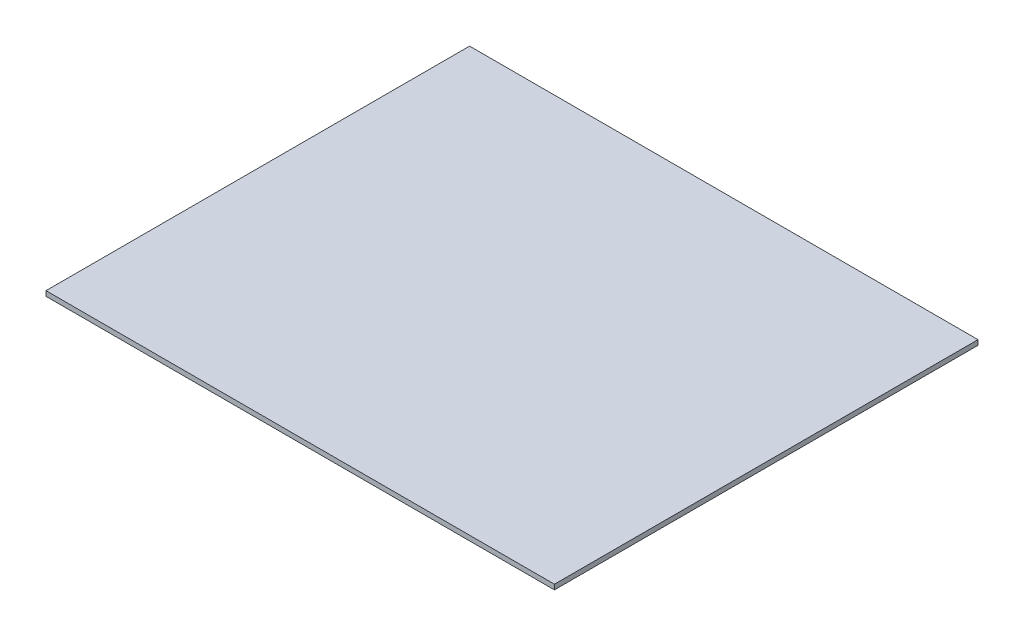
ISO-10303-21;
HEADER;
FILE_DESCRIPTION(('STEP AP214'),'2;1');
FILE_NAME('part.step','',(''),(''),'','','');
FILE_SCHEMA(('AUTOMOTIVE_DESIGN { 1 0 10303 214 1 1 1 1 }'));
ENDSEC;
DATA;
#1=APPLICATION_CONTEXT('core data for automotive mechanical design processes');
#2=APPLICATION_PROTOCOL_DEFINITION('international standard','automotive_design',2000,#1);
#3=PRODUCT_CONTEXT('',#1,'mechanical');
#4=PRODUCT('Part','Part','',(#3));
#5=PRODUCT_RELATED_PRODUCT_CATEGORY('part','',(#4));
#6=PRODUCT_DEFINITION_FORMATION('','',#4);
#7=PRODUCT_DEFINITION_CONTEXT('part definition',#1,'design');
#8=PRODUCT_DEFINITION('design','',#6,#7);
#9=PRODUCT_DEFINITION_SHAPE('','',#8);
#10=(LENGTH_UNIT() NAMED_UNIT(*) SI_UNIT(.MILLI.,.METRE.));
#11=(NAMED_UNIT(*) PLANE_ANGLE_UNIT() SI_UNIT($,.RADIAN.));
#12=(NAMED_UNIT(*) SI_UNIT($,.STERADIAN.) SOLID_ANGLE_UNIT());
#13=UNCERTAINTY_MEASURE_WITH_UNIT(LENGTH_MEASURE(1.E-05),#10,'distance_accuracy_value','');
#14=(GEOMETRIC_REPRESENTATION_CONTEXT(3) GLOBAL_UNCERTAINTY_ASSIGNED_CONTEXT((#13)) GLOBAL_UNIT_ASSIGNED_CONTEXT((#10,
#11,#12)) REPRESENTATION_CONTEXT('',''));
#15=CARTESIAN_POINT('',(0.,0.,0.));
#16=DIRECTION('',(0.,0.,1.));
#17=DIRECTION('',(1.,0.,0.));
#18=AXIS2_PLACEMENT_3D('',#15,#16,#17);
#19=CARTESIAN_POINT('',(3.85261401270476,2.,9.8935299865384));
#20=DIRECTION('',(1.,0.,0.));
#21=DIRECTION('',(0.,0.,-1.));
#22=AXIS2_PLACEMENT_3D('',#19,#20,#21);
#23=PLANE('',#22);
#24=DIRECTION('',(0.,0.,1.));
#25=VECTOR('',#24,1.);
#26=CARTESIAN_POINT('',(3.85261401270476,0.,9.8935299865384));
#27=LINE('',#26,#25);
#28=CARTESIAN_POINT('',(3.85261401270476,0.,9.8935299865384));
#29=VERTEX_POINT('',#28);
#30=CARTESIAN_POINT('',(3.85261401270476,0.,181.513529986538));
#31=VERTEX_POINT('',#30);
#32=EDGE_CURVE('E95',#29,#31,#27,.T.);
#33=ORIENTED_EDGE('',*,*,#32,.T.);
#34=DIRECTION('',(0.,-1.,0.));
#35=VECTOR('',#34,1.);
#36=CARTESIAN_POINT('',(3.85261401270476,2.,181.513529986538));
#37=LINE('',#36,#35);
#38=CARTESIAN_POINT('',(3.85261401270476,2.,181.513529986538));
#39=VERTEX_POINT('',#38);
#40=EDGE_CURVE('E11',#39,#31,#37,.T.);
#41=ORIENTED_EDGE('',*,*,#40,.F.);
#42=DIRECTION('',(0.,0.,1.));
#43=VECTOR('',#42,1.);
#44=CARTESIAN_POINT('',(3.85261401270476,2.,9.8935299865384));
#45=LINE('',#44,#43);
#46=CARTESIAN_POINT('',(3.85261401270476,2.,9.8935299865384));
#47=VERTEX_POINT('',#46);
#48=EDGE_CURVE('E83',#47,#39,#45,.T.);
#49=ORIENTED_EDGE('',*,*,#48,.F.);
#50=DIRECTION('',(0.,-1.,0.));
#51=VECTOR('',#50,1.);
#52=CARTESIAN_POINT('',(3.85261401270476,2.,9.8935299865384));
#53=LINE('',#52,#51);
#54=EDGE_CURVE('E91',#47,#29,#53,.T.);
#55=ORIENTED_EDGE('',*,*,#54,.T.);
#56=EDGE_LOOP('',(#33,#41,#49,#55));
#57=FACE_BOUND('',#56,.T.);
#58=ADVANCED_FACE('F32',(#57),#23,.F.);
#59=CARTESIAN_POINT('',(3.85261401270476,2.,181.513529986538));
#60=DIRECTION('',(0.,0.,-1.));
#61=DIRECTION('',(-1.,0.,0.));
#62=AXIS2_PLACEMENT_3D('',#59,#60,#61);
#63=PLANE('',#62);
#64=DIRECTION('',(1.,0.,0.));
#65=VECTOR('',#64,1.);
#66=CARTESIAN_POINT('',(3.85261401270476,0.,181.513529986538));
#67=LINE('',#66,#65);
#68=CARTESIAN_POINT('',(209.85261011573,0.,181.513529986538));
#69=VERTEX_POINT('',#68);
#70=EDGE_CURVE('E87',#31,#69,#67,.T.);
#71=ORIENTED_EDGE('',*,*,#70,.T.);
#72=DIRECTION('',(0.,-1.,0.));
#73=VECTOR('',#72,1.);
#74=CARTESIAN_POINT('',(209.85261011573,2.,181.513529986538));
#75=LINE('',#74,#73);
#76=CARTESIAN_POINT('',(209.85261011573,2.,181.513529986538));
#77=VERTEX_POINT('',#76);
#78=EDGE_CURVE('E40',#77,#69,#75,.T.);
#79=ORIENTED_EDGE('',*,*,#78,.F.);
#80=DIRECTION('',(1.,0.,0.));
#81=VECTOR('',#80,1.);
#82=CARTESIAN_POINT('',(3.85261401270476,2.,181.513529986538));
#83=LINE('',#82,#81);
#84=EDGE_CURVE('E78',#39,#77,#83,.T.);
#85=ORIENTED_EDGE('',*,*,#84,.F.);
#86=ORIENTED_EDGE('',*,*,#40,.T.);
#87=EDGE_LOOP('',(#71,#79,#85,#86));
#88=FACE_BOUND('',#87,.T.);
#89=ADVANCED_FACE('F86',(#88),#63,.F.);
#90=CARTESIAN_POINT('',(209.852610115729,2.,9.89352998653841));
#91=DIRECTION('',(-1.,0.,0.));
#92=DIRECTION('',(0.,0.,1.));
#93=AXIS2_PLACEMENT_3D('',#90,#91,#92);
#94=PLANE('',#93);
#95=DIRECTION('',(0.,0.,-1.));
#96=VECTOR('',#95,1.);
#97=CARTESIAN_POINT('',(209.852610115729,0.,9.89352998653841));
#98=LINE('',#97,#96);
#99=CARTESIAN_POINT('',(209.852610115729,0.,9.89352998653841));
#100=VERTEX_POINT('',#99);
#101=EDGE_CURVE('E65',#69,#100,#98,.T.);
#102=ORIENTED_EDGE('',*,*,#101,.T.);
#103=DIRECTION('',(0.,-1.,0.));
#104=VECTOR('',#103,1.);
#105=CARTESIAN_POINT('',(209.852610115729,2.,9.89352998653841));
#106=LINE('',#105,#104);
#107=CARTESIAN_POINT('',(209.852610115729,2.,9.89352998653841));
#108=VERTEX_POINT('',#107);
#109=EDGE_CURVE('E88',#108,#100,#106,.T.);
#110=ORIENTED_EDGE('',*,*,#109,.F.);
#111=DIRECTION('',(0.,0.,-1.));
#112=VECTOR('',#111,1.);
#113=CARTESIAN_POINT('',(209.852610115729,2.,9.89352998653841));
#114=LINE('',#113,#112);
#115=EDGE_CURVE('E81',#77,#108,#114,.T.);
#116=ORIENTED_EDGE('',*,*,#115,.F.);
#117=ORIENTED_EDGE('',*,*,#78,.T.);
#118=EDGE_LOOP('',(#102,#110,#116,#117));
#119=FACE_BOUND('',#118,.T.);
#120=ADVANCED_FACE('F89',(#119),#94,.F.);
#121=CARTESIAN_POINT('',(3.85261401270476,2.,9.8935299865384));
#122=DIRECTION('',(0.,0.,1.));
#123=DIRECTION('',(1.,0.,0.));
#124=AXIS2_PLACEMENT_3D('',#121,#122,#123);
#125=PLANE('',#124);
#126=DIRECTION('',(-1.,0.,0.));
#127=VECTOR('',#126,1.);
#128=CARTESIAN_POINT('',(3.85261401270476,0.,9.8935299865384));
#129=LINE('',#128,#127);
#130=EDGE_CURVE('E71',#100,#29,#129,.T.);
#131=ORIENTED_EDGE('',*,*,#130,.T.);
#132=ORIENTED_EDGE('',*,*,#54,.F.);
#133=DIRECTION('',(-1.,0.,0.));
#134=VECTOR('',#133,1.);
#135=CARTESIAN_POINT('',(3.85261401270476,2.,9.8935299865384));
#136=LINE('',#135,#134);
#137=EDGE_CURVE('E48',#108,#47,#136,.T.);
#138=ORIENTED_EDGE('',*,*,#137,.F.);
#139=ORIENTED_EDGE('',*,*,#109,.T.);
#140=EDGE_LOOP('',(#131,#132,#138,#139));
#141=FACE_BOUND('',#140,.T.);
#142=ADVANCED_FACE('F102',(#141),#125,.F.);
#143=CARTESIAN_POINT('',(3.85261401270476,2.,181.513529986538));
#144=DIRECTION('',(0.,1.,0.));
#145=DIRECTION('',(0.,0.,1.));
#146=AXIS2_PLACEMENT_3D('',#143,#144,#145);
#147=PLANE('',#146);
#148=ORIENTED_EDGE('',*,*,#48,.T.);
#149=ORIENTED_EDGE('',*,*,#84,.T.);
#150=ORIENTED_EDGE('',*,*,#115,.T.);
#151=ORIENTED_EDGE('',*,*,#137,.T.);
#152=EDGE_LOOP('',(#148,#149,#150,#151));
#153=FACE_BOUND('',#152,.T.);
#154=ADVANCED_FACE('F79',(#153),#147,.T.);
#155=CARTESIAN_POINT('',(3.85261401270476,0.,181.513529986538));
#156=DIRECTION('',(0.,1.,0.));
#157=DIRECTION('',(0.,0.,1.));
#158=AXIS2_PLACEMENT_3D('',#155,#156,#157);
#159=PLANE('',#158);
#160=ORIENTED_EDGE('',*,*,#32,.F.);
#161=ORIENTED_EDGE('',*,*,#130,.F.);
#162=ORIENTED_EDGE('',*,*,#101,.F.);
#163=ORIENTED_EDGE('',*,*,#70,.F.);
#164=EDGE_LOOP('',(#160,#161,#162,#163));
#165=FACE_BOUND('',#164,.T.);
#166=ADVANCED_FACE('F105',(#165),#159,.F.);
#167=CLOSED_SHELL('',(#58,#89,#120,#142,#154,#166));
#168=MANIFOLD_SOLID_BREP('B2',#167);
#169=ADVANCED_BREP_SHAPE_REPRESENTATION('',(#18,#168),#14);
#170=SHAPE_DEFINITION_REPRESENTATION(#9,#169);
ENDSEC;
END-ISO-10303-21;
